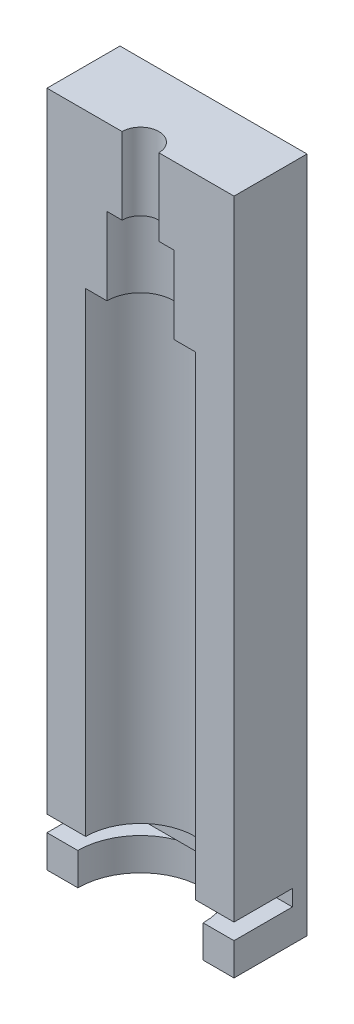
ISO-10303-21;
HEADER;
FILE_DESCRIPTION(('STEP AP214'),'2;1');
FILE_NAME('part.step','',(''),(''),'','','');
FILE_SCHEMA(('AUTOMOTIVE_DESIGN { 1 0 10303 214 1 1 1 1 }'));
ENDSEC;
DATA;
#1=APPLICATION_CONTEXT('core data for automotive mechanical design processes');
#2=APPLICATION_PROTOCOL_DEFINITION('international standard','automotive_design',2000,#1);
#3=PRODUCT_CONTEXT('',#1,'mechanical');
#4=PRODUCT('Part','Part','',(#3));
#5=PRODUCT_RELATED_PRODUCT_CATEGORY('part','',(#4));
#6=PRODUCT_DEFINITION_FORMATION('','',#4);
#7=PRODUCT_DEFINITION_CONTEXT('part definition',#1,'design');
#8=PRODUCT_DEFINITION('design','',#6,#7);
#9=PRODUCT_DEFINITION_SHAPE('','',#8);
#10=(LENGTH_UNIT() NAMED_UNIT(*) SI_UNIT(.MILLI.,.METRE.));
#11=(NAMED_UNIT(*) PLANE_ANGLE_UNIT() SI_UNIT($,.RADIAN.));
#12=(NAMED_UNIT(*) SI_UNIT($,.STERADIAN.) SOLID_ANGLE_UNIT());
#13=UNCERTAINTY_MEASURE_WITH_UNIT(LENGTH_MEASURE(1.E-05),#10,'distance_accuracy_value','');
#14=(GEOMETRIC_REPRESENTATION_CONTEXT(3) GLOBAL_UNCERTAINTY_ASSIGNED_CONTEXT((#13)) GLOBAL_UNIT_ASSIGNED_CONTEXT((#10,
#11,#12)) REPRESENTATION_CONTEXT('',''));
#15=CARTESIAN_POINT('',(0.,0.,0.));
#16=DIRECTION('',(0.,0.,1.));
#17=DIRECTION('',(1.,0.,0.));
#18=AXIS2_PLACEMENT_3D('',#15,#16,#17);
#19=CARTESIAN_POINT('',(0.,0.,10.));
#20=DIRECTION('',(0.,0.,-1.));
#21=DIRECTION('',(-1.,0.,0.));
#22=AXIS2_PLACEMENT_3D('',#19,#20,#21);
#23=PLANE('',#22);
#24=DIRECTION('',(0.,-1.,0.));
#25=VECTOR('',#24,1.);
#26=CARTESIAN_POINT('',(-124.383047755614,-75.,10.));
#27=LINE('',#26,#25);
#28=CARTESIAN_POINT('',(-124.383047755614,17.7491601343785,10.));
#29=VERTEX_POINT('',#28);
#30=CARTESIAN_POINT('',(-124.383047755614,-68.3710816059266,10.));
#31=VERTEX_POINT('',#30);
#32=EDGE_CURVE('E163',#29,#31,#27,.T.);
#33=ORIENTED_EDGE('',*,*,#32,.F.);
#34=DIRECTION('',(1.,0.,0.));
#35=VECTOR('',#34,1.);
#36=CARTESIAN_POINT('',(-150.,17.7491601343785,10.));
#37=LINE('',#36,#35);
#38=CARTESIAN_POINT('',(-134.67339682012,17.7491601343785,10.));
#39=VERTEX_POINT('',#38);
#40=EDGE_CURVE('E43',#39,#29,#37,.T.);
#41=ORIENTED_EDGE('',*,*,#40,.F.);
#42=DIRECTION('',(0.,-1.,0.));
#43=VECTOR('',#42,1.);
#44=CARTESIAN_POINT('',(-134.67339682012,-3.37108160592661,10.));
#45=LINE('',#44,#43);
#46=CARTESIAN_POINT('',(-134.67339682012,7.23653437832854,10.));
#47=VERTEX_POINT('',#46);
#48=EDGE_CURVE('E60',#47,#39,#45,.F.);
#49=ORIENTED_EDGE('',*,*,#48,.F.);
#50=DIRECTION('',(-1.,0.,0.));
#51=VECTOR('',#50,1.);
#52=CARTESIAN_POINT('',(0.,7.23653437832854,10.));
#53=LINE('',#52,#51);
#54=CARTESIAN_POINT('',(-132.591523877807,7.23653437832854,10.));
#55=VERTEX_POINT('',#54);
#56=EDGE_CURVE('E11',#55,#47,#53,.T.);
#57=ORIENTED_EDGE('',*,*,#56,.F.);
#58=DIRECTION('',(0.,-1.,0.));
#59=VECTOR('',#58,1.);
#60=CARTESIAN_POINT('',(-132.591523877807,-3.37108160592661,10.));
#61=LINE('',#60,#59);
#62=CARTESIAN_POINT('',(-132.591523877807,-3.37108160592661,10.));
#63=VERTEX_POINT('',#62);
#64=EDGE_CURVE('E287',#63,#55,#61,.F.);
#65=ORIENTED_EDGE('',*,*,#64,.F.);
#66=DIRECTION('',(-1.,0.,0.));
#67=VECTOR('',#66,1.);
#68=CARTESIAN_POINT('',(0.,-3.37108160592661,10.));
#69=LINE('',#68,#67);
#70=CARTESIAN_POINT('',(-129.691523877807,-3.37108160592661,10.));
#71=VERTEX_POINT('',#70);
#72=EDGE_CURVE('E254',#71,#63,#69,.T.);
#73=ORIENTED_EDGE('',*,*,#72,.F.);
#74=DIRECTION('',(0.,1.,0.));
#75=VECTOR('',#74,1.);
#76=CARTESIAN_POINT('',(-129.691523877807,75.,10.));
#77=LINE('',#76,#75);
#78=CARTESIAN_POINT('',(-129.691523877807,-68.3710816059266,10.));
#79=VERTEX_POINT('',#78);
#80=EDGE_CURVE('E210',#79,#71,#77,.T.);
#81=ORIENTED_EDGE('',*,*,#80,.F.);
#82=DIRECTION('',(-1.,0.,0.));
#83=VECTOR('',#82,1.);
#84=CARTESIAN_POINT('',(-150.383047755614,-68.3710816059266,10.));
#85=LINE('',#84,#83);
#86=EDGE_CURVE('E172',#31,#79,#85,.T.);
#87=ORIENTED_EDGE('',*,*,#86,.F.);
#88=EDGE_LOOP('',(#33,#41,#49,#57,#65,#73,#81,#87));
#89=FACE_BOUND('',#88,.T.);
#90=ADVANCED_FACE('F39',(#89),#23,.F.);
#91=DIRECTION('',(0.,-1.,0.));
#92=VECTOR('',#91,1.);
#93=CARTESIAN_POINT('',(-124.383047755614,-75.,10.));
#94=LINE('',#93,#92);
#95=CARTESIAN_POINT('',(-124.383047755614,-70.5710816059266,10.));
#96=VERTEX_POINT('',#95);
#97=CARTESIAN_POINT('',(-124.383047755614,-75.,10.));
#98=VERTEX_POINT('',#97);
#99=EDGE_CURVE('E174',#96,#98,#94,.T.);
#100=ORIENTED_EDGE('',*,*,#99,.F.);
#101=DIRECTION('',(1.,0.,0.));
#102=VECTOR('',#101,1.);
#103=CARTESIAN_POINT('',(-150.383047755614,-70.5710816059266,10.));
#104=LINE('',#103,#102);
#105=CARTESIAN_POINT('',(-128.604847788354,-70.5710816059266,10.));
#106=VERTEX_POINT('',#105);
#107=EDGE_CURVE('E230',#106,#96,#104,.T.);
#108=ORIENTED_EDGE('',*,*,#107,.F.);
#109=DIRECTION('',(0.,1.,0.));
#110=VECTOR('',#109,1.);
#111=CARTESIAN_POINT('',(-128.604847788354,-70.5710816059266,10.));
#112=LINE('',#111,#110);
#113=CARTESIAN_POINT('',(-128.604847788354,-75.,10.));
#114=VERTEX_POINT('',#113);
#115=EDGE_CURVE('E184',#106,#114,#112,.F.);
#116=ORIENTED_EDGE('',*,*,#115,.T.);
#117=DIRECTION('',(-1.,0.,0.));
#118=VECTOR('',#117,1.);
#119=CARTESIAN_POINT('',(0.,-75.,10.));
#120=LINE('',#119,#118);
#121=EDGE_CURVE('E235',#114,#98,#120,.F.);
#122=ORIENTED_EDGE('',*,*,#121,.T.);
#123=EDGE_LOOP('',(#100,#108,#116,#122));
#124=FACE_BOUND('',#123,.T.);
#125=ADVANCED_FACE('F272',(#124),#23,.F.);
#126=CARTESIAN_POINT('',(0.,0.,0.));
#127=DIRECTION('',(0.,0.,-1.));
#128=DIRECTION('',(-1.,0.,0.));
#129=AXIS2_PLACEMENT_3D('',#126,#127,#128);
#130=PLANE('',#129);
#131=DIRECTION('',(1.,0.,0.));
#132=VECTOR('',#131,1.);
#133=CARTESIAN_POINT('',(-150.,17.7491601343785,0.));
#134=LINE('',#133,#132);
#135=CARTESIAN_POINT('',(-150.,17.7491601343785,0.));
#136=VERTEX_POINT('',#135);
#137=CARTESIAN_POINT('',(-124.383047755614,17.7491601343785,0.));
#138=VERTEX_POINT('',#137);
#139=EDGE_CURVE('E185',#136,#138,#134,.T.);
#140=ORIENTED_EDGE('',*,*,#139,.T.);
#141=DIRECTION('',(0.,-1.,0.));
#142=VECTOR('',#141,1.);
#143=CARTESIAN_POINT('',(-124.383047755614,-75.,0.));
#144=LINE('',#143,#142);
#145=CARTESIAN_POINT('',(-124.383047755614,-75.,0.));
#146=VERTEX_POINT('',#145);
#147=EDGE_CURVE('E161',#138,#146,#144,.T.);
#148=ORIENTED_EDGE('',*,*,#147,.T.);
#149=DIRECTION('',(1.,0.,0.));
#150=VECTOR('',#149,1.);
#151=CARTESIAN_POINT('',(150.,-75.,0.));
#152=LINE('',#151,#150);
#153=CARTESIAN_POINT('',(-150.,-75.,0.));
#154=VERTEX_POINT('',#153);
#155=EDGE_CURVE('E237',#154,#146,#152,.T.);
#156=ORIENTED_EDGE('',*,*,#155,.F.);
#157=DIRECTION('',(0.,-1.,0.));
#158=VECTOR('',#157,1.);
#159=CARTESIAN_POINT('',(-150.,-75.,0.));
#160=LINE('',#159,#158);
#161=EDGE_CURVE('E240',#136,#154,#160,.T.);
#162=ORIENTED_EDGE('',*,*,#161,.F.);
#163=EDGE_LOOP('',(#140,#148,#156,#162));
#164=FACE_BOUND('',#163,.T.);
#165=ADVANCED_FACE('F316',(#164),#130,.T.);
#166=CARTESIAN_POINT('',(-150.,17.7491601343785,0.));
#167=DIRECTION('',(0.,-1.,0.));
#168=DIRECTION('',(0.,0.,-1.));
#169=AXIS2_PLACEMENT_3D('',#166,#167,#168);
#170=PLANE('',#169);
#171=DIRECTION('',(0.,0.,1.));
#172=VECTOR('',#171,1.);
#173=CARTESIAN_POINT('',(-124.383047755614,17.7491601343785,0.));
#174=LINE('',#173,#172);
#175=EDGE_CURVE('E159',#138,#29,#174,.T.);
#176=ORIENTED_EDGE('',*,*,#175,.F.);
#177=ORIENTED_EDGE('',*,*,#139,.F.);
#178=DIRECTION('',(0.,0.,1.));
#179=VECTOR('',#178,1.);
#180=CARTESIAN_POINT('',(-150.,17.7491601343785,0.));
#181=LINE('',#180,#179);
#182=CARTESIAN_POINT('',(-150.,17.7491601343785,10.));
#183=VERTEX_POINT('',#182);
#184=EDGE_CURVE('E200',#136,#183,#181,.T.);
#185=ORIENTED_EDGE('',*,*,#184,.T.);
#186=DIRECTION('',(1.,0.,0.));
#187=VECTOR('',#186,1.);
#188=CARTESIAN_POINT('',(-150.,17.7491601343785,10.));
#189=LINE('',#188,#187);
#190=CARTESIAN_POINT('',(-139.709650935494,17.7491601343785,10.));
#191=VERTEX_POINT('',#190);
#192=EDGE_CURVE('E179',#183,#191,#189,.T.);
#193=ORIENTED_EDGE('',*,*,#192,.T.);
#194=CARTESIAN_POINT('',(-137.191523877807,17.7491601343785,10.));
#195=DIRECTION('',(0.,-1.,0.));
#196=DIRECTION('',(0.,0.,-1.));
#197=AXIS2_PLACEMENT_3D('',#194,#195,#196);
#198=CIRCLE('',#197,2.51812705768732);
#199=EDGE_CURVE('E177',#39,#191,#198,.F.);
#200=ORIENTED_EDGE('',*,*,#199,.F.);
#201=ORIENTED_EDGE('',*,*,#40,.T.);
#202=EDGE_LOOP('',(#176,#177,#185,#193,#200,#201));
#203=FACE_BOUND('',#202,.T.);
#204=ADVANCED_FACE('F180',(#203),#170,.F.);
#205=DIRECTION('',(0.,-1.,0.));
#206=VECTOR('',#205,1.);
#207=CARTESIAN_POINT('',(-139.709650935494,-3.37108160592661,10.));
#208=LINE('',#207,#206);
#209=CARTESIAN_POINT('',(-139.709650935494,7.23653437832854,10.));
#210=VERTEX_POINT('',#209);
#211=EDGE_CURVE('E262',#191,#210,#208,.T.);
#212=ORIENTED_EDGE('',*,*,#211,.F.);
#213=ORIENTED_EDGE('',*,*,#192,.F.);
#214=DIRECTION('',(0.,-1.,0.));
#215=VECTOR('',#214,1.);
#216=CARTESIAN_POINT('',(-150.,-75.,10.));
#217=LINE('',#216,#215);
#218=CARTESIAN_POINT('',(-150.,-68.3710816059266,10.));
#219=VERTEX_POINT('',#218);
#220=EDGE_CURVE('E229',#183,#219,#217,.T.);
#221=ORIENTED_EDGE('',*,*,#220,.T.);
#222=CARTESIAN_POINT('',(-144.691523877807,-68.3710816059266,10.));
#223=VERTEX_POINT('',#222);
#224=EDGE_CURVE('E211',#223,#219,#85,.T.);
#225=ORIENTED_EDGE('',*,*,#224,.F.);
#226=DIRECTION('',(0.,1.,0.));
#227=VECTOR('',#226,1.);
#228=CARTESIAN_POINT('',(-144.691523877807,75.,10.));
#229=LINE('',#228,#227);
#230=CARTESIAN_POINT('',(-144.691523877807,-3.37108160592661,10.));
#231=VERTEX_POINT('',#230);
#232=EDGE_CURVE('E209',#231,#223,#229,.F.);
#233=ORIENTED_EDGE('',*,*,#232,.F.);
#234=CARTESIAN_POINT('',(-141.791523877807,-3.37108160592661,10.));
#235=VERTEX_POINT('',#234);
#236=EDGE_CURVE('E255',#235,#231,#69,.T.);
#237=ORIENTED_EDGE('',*,*,#236,.F.);
#238=DIRECTION('',(0.,-1.,0.));
#239=VECTOR('',#238,1.);
#240=CARTESIAN_POINT('',(-141.791523877807,-3.37108160592661,10.));
#241=LINE('',#240,#239);
#242=CARTESIAN_POINT('',(-141.791523877807,7.23653437832854,10.));
#243=VERTEX_POINT('',#242);
#244=EDGE_CURVE('E263',#243,#235,#241,.T.);
#245=ORIENTED_EDGE('',*,*,#244,.F.);
#246=EDGE_CURVE('E47',#210,#243,#53,.T.);
#247=ORIENTED_EDGE('',*,*,#246,.F.);
#248=EDGE_LOOP('',(#212,#213,#221,#225,#233,#237,#245,#247));
#249=FACE_BOUND('',#248,.T.);
#250=ADVANCED_FACE('F325',(#249),#23,.F.);
#251=DIRECTION('',(1.,0.,0.));
#252=VECTOR('',#251,1.);
#253=CARTESIAN_POINT('',(150.,-75.,10.));
#254=LINE('',#253,#252);
#255=CARTESIAN_POINT('',(-150.,-75.,10.));
#256=VERTEX_POINT('',#255);
#257=CARTESIAN_POINT('',(-145.778199967261,-75.,10.));
#258=VERTEX_POINT('',#257);
#259=EDGE_CURVE('E234',#256,#258,#254,.T.);
#260=ORIENTED_EDGE('',*,*,#259,.T.);
#261=DIRECTION('',(0.,1.,0.));
#262=VECTOR('',#261,1.);
#263=CARTESIAN_POINT('',(-145.778199967261,-70.5710816059266,10.));
#264=LINE('',#263,#262);
#265=CARTESIAN_POINT('',(-145.778199967261,-70.5710816059266,10.));
#266=VERTEX_POINT('',#265);
#267=EDGE_CURVE('E181',#258,#266,#264,.T.);
#268=ORIENTED_EDGE('',*,*,#267,.T.);
#269=CARTESIAN_POINT('',(-150.,-70.5710816059266,10.));
#270=VERTEX_POINT('',#269);
#271=EDGE_CURVE('E228',#270,#266,#104,.T.);
#272=ORIENTED_EDGE('',*,*,#271,.F.);
#273=EDGE_CURVE('E231',#270,#256,#217,.T.);
#274=ORIENTED_EDGE('',*,*,#273,.T.);
#275=EDGE_LOOP('',(#260,#268,#272,#274));
#276=FACE_BOUND('',#275,.T.);
#277=ADVANCED_FACE('F317',(#276),#23,.F.);
#278=CARTESIAN_POINT('',(-150.383047755614,-70.5710816059266,2.));
#279=DIRECTION('',(0.,-1.,0.));
#280=DIRECTION('',(0.,0.,-1.));
#281=AXIS2_PLACEMENT_3D('',#278,#279,#280);
#282=PLANE('',#281);
#283=DIRECTION('',(1.,0.,0.));
#284=VECTOR('',#283,1.);
#285=CARTESIAN_POINT('',(-150.383047755614,-70.5710816059266,2.));
#286=LINE('',#285,#284);
#287=CARTESIAN_POINT('',(-134.072067792976,-70.5710816059266,2.));
#288=VERTEX_POINT('',#287);
#289=CARTESIAN_POINT('',(-124.383047755614,-70.5710816059266,2.));
#290=VERTEX_POINT('',#289);
#291=EDGE_CURVE('E220',#288,#290,#286,.T.);
#292=ORIENTED_EDGE('',*,*,#291,.F.);
#293=CARTESIAN_POINT('',(-137.191523877807,-70.5710816059266,10.));
#294=DIRECTION('',(0.,1.,0.));
#295=DIRECTION('',(0.,0.,1.));
#296=AXIS2_PLACEMENT_3D('',#293,#294,#295);
#297=CIRCLE('',#296,8.58667608945341);
#298=EDGE_CURVE('E199',#106,#288,#297,.T.);
#299=ORIENTED_EDGE('',*,*,#298,.F.);
#300=ORIENTED_EDGE('',*,*,#107,.T.);
#301=DIRECTION('',(0.,0.,1.));
#302=VECTOR('',#301,1.);
#303=CARTESIAN_POINT('',(-124.383047755614,-70.5710816059266,2.));
#304=LINE('',#303,#302);
#305=EDGE_CURVE('E239',#290,#96,#304,.T.);
#306=ORIENTED_EDGE('',*,*,#305,.F.);
#307=EDGE_LOOP('',(#292,#299,#300,#306));
#308=FACE_BOUND('',#307,.T.);
#309=ADVANCED_FACE('F304',(#308),#282,.F.);
#310=CARTESIAN_POINT('',(-150.,-75.,10.));
#311=DIRECTION('',(1.,0.,0.));
#312=DIRECTION('',(0.,0.,-1.));
#313=AXIS2_PLACEMENT_3D('',#310,#311,#312);
#314=PLANE('',#313);
#315=ORIENTED_EDGE('',*,*,#184,.F.);
#316=ORIENTED_EDGE('',*,*,#161,.T.);
#317=DIRECTION('',(0.,0.,-1.));
#318=VECTOR('',#317,1.);
#319=CARTESIAN_POINT('',(-150.,-75.,10.));
#320=LINE('',#319,#318);
#321=EDGE_CURVE('E236',#256,#154,#320,.T.);
#322=ORIENTED_EDGE('',*,*,#321,.F.);
#323=ORIENTED_EDGE('',*,*,#273,.F.);
#324=DIRECTION('',(0.,0.,-1.));
#325=VECTOR('',#324,1.);
#326=CARTESIAN_POINT('',(-150.,-70.5710816059266,10.));
#327=LINE('',#326,#325);
#328=CARTESIAN_POINT('',(-150.,-70.5710816059266,2.));
#329=VERTEX_POINT('',#328);
#330=EDGE_CURVE('E248',#270,#329,#327,.T.);
#331=ORIENTED_EDGE('',*,*,#330,.T.);
#332=DIRECTION('',(0.,-1.,0.));
#333=VECTOR('',#332,1.);
#334=CARTESIAN_POINT('',(-150.,-75.,2.));
#335=LINE('',#334,#333);
#336=CARTESIAN_POINT('',(-150.,-68.3710816059266,2.));
#337=VERTEX_POINT('',#336);
#338=EDGE_CURVE('E226',#337,#329,#335,.T.);
#339=ORIENTED_EDGE('',*,*,#338,.F.);
#340=DIRECTION('',(0.,0.,1.));
#341=VECTOR('',#340,1.);
#342=CARTESIAN_POINT('',(-150.,-68.3710816059266,10.));
#343=LINE('',#342,#341);
#344=EDGE_CURVE('E246',#337,#219,#343,.T.);
#345=ORIENTED_EDGE('',*,*,#344,.T.);
#346=ORIENTED_EDGE('',*,*,#220,.F.);
#347=EDGE_LOOP('',(#315,#316,#322,#323,#331,#339,#345,#346));
#348=FACE_BOUND('',#347,.T.);
#349=ADVANCED_FACE('F41',(#348),#314,.F.);
#350=CARTESIAN_POINT('',(150.,-75.,10.));
#351=DIRECTION('',(0.,1.,0.));
#352=DIRECTION('',(0.,0.,1.));
#353=AXIS2_PLACEMENT_3D('',#350,#351,#352);
#354=PLANE('',#353);
#355=ORIENTED_EDGE('',*,*,#155,.T.);
#356=DIRECTION('',(0.,0.,1.));
#357=VECTOR('',#356,1.);
#358=CARTESIAN_POINT('',(-124.383047755614,-75.,0.));
#359=LINE('',#358,#357);
#360=EDGE_CURVE('E153',#146,#98,#359,.T.);
#361=ORIENTED_EDGE('',*,*,#360,.T.);
#362=ORIENTED_EDGE('',*,*,#121,.F.);
#363=CARTESIAN_POINT('',(-137.191523877807,-75.,10.));
#364=DIRECTION('',(0.,1.,0.));
#365=DIRECTION('',(0.,0.,1.));
#366=AXIS2_PLACEMENT_3D('',#363,#364,#365);
#367=CIRCLE('',#366,8.58667608945341);
#368=EDGE_CURVE('E192',#114,#258,#367,.T.);
#369=ORIENTED_EDGE('',*,*,#368,.T.);
#370=ORIENTED_EDGE('',*,*,#259,.F.);
#371=ORIENTED_EDGE('',*,*,#321,.T.);
#372=EDGE_LOOP('',(#355,#361,#362,#369,#370,#371));
#373=FACE_BOUND('',#372,.T.);
#374=ADVANCED_FACE('F273',(#373),#354,.F.);
#375=ORIENTED_EDGE('',*,*,#271,.T.);
#376=CARTESIAN_POINT('',(-140.310979962638,-70.5710816059266,2.));
#377=VERTEX_POINT('',#376);
#378=EDGE_CURVE('E290',#377,#266,#297,.T.);
#379=ORIENTED_EDGE('',*,*,#378,.F.);
#380=EDGE_CURVE('E218',#329,#377,#286,.T.);
#381=ORIENTED_EDGE('',*,*,#380,.F.);
#382=ORIENTED_EDGE('',*,*,#330,.F.);
#383=EDGE_LOOP('',(#375,#379,#381,#382));
#384=FACE_BOUND('',#383,.T.);
#385=ADVANCED_FACE('F311',(#384),#282,.F.);
#386=CARTESIAN_POINT('',(-150.383047755614,-68.3710816059266,2.));
#387=DIRECTION('',(0.,1.,0.));
#388=DIRECTION('',(0.,0.,1.));
#389=AXIS2_PLACEMENT_3D('',#386,#387,#388);
#390=PLANE('',#389);
#391=CARTESIAN_POINT('',(-137.191523877807,-68.3710816059266,10.));
#392=DIRECTION('',(0.,1.,0.));
#393=DIRECTION('',(0.,0.,1.));
#394=AXIS2_PLACEMENT_3D('',#391,#392,#393);
#395=CIRCLE('',#394,7.49999999999995);
#396=EDGE_CURVE('E202',#79,#223,#395,.T.);
#397=ORIENTED_EDGE('',*,*,#396,.T.);
#398=ORIENTED_EDGE('',*,*,#224,.T.);
#399=ORIENTED_EDGE('',*,*,#344,.F.);
#400=DIRECTION('',(-1.,0.,0.));
#401=VECTOR('',#400,1.);
#402=CARTESIAN_POINT('',(-150.383047755614,-68.3710816059266,2.));
#403=LINE('',#402,#401);
#404=CARTESIAN_POINT('',(-124.383047755614,-68.3710816059266,2.));
#405=VERTEX_POINT('',#404);
#406=EDGE_CURVE('E215',#405,#337,#403,.T.);
#407=ORIENTED_EDGE('',*,*,#406,.F.);
#408=DIRECTION('',(0.,0.,1.));
#409=VECTOR('',#408,1.);
#410=CARTESIAN_POINT('',(-124.383047755614,-68.3710816059266,2.));
#411=LINE('',#410,#409);
#412=EDGE_CURVE('E225',#405,#31,#411,.T.);
#413=ORIENTED_EDGE('',*,*,#412,.T.);
#414=ORIENTED_EDGE('',*,*,#86,.T.);
#415=EDGE_LOOP('',(#397,#398,#399,#407,#413,#414));
#416=FACE_BOUND('',#415,.T.);
#417=ADVANCED_FACE('F330',(#416),#390,.F.);
#418=CARTESIAN_POINT('',(0.,0.,2.));
#419=DIRECTION('',(0.,0.,1.));
#420=DIRECTION('',(1.,0.,0.));
#421=AXIS2_PLACEMENT_3D('',#418,#419,#420);
#422=PLANE('',#421);
#423=ORIENTED_EDGE('',*,*,#338,.T.);
#424=ORIENTED_EDGE('',*,*,#380,.T.);
#425=EDGE_CURVE('E224',#377,#288,#286,.T.);
#426=ORIENTED_EDGE('',*,*,#425,.T.);
#427=ORIENTED_EDGE('',*,*,#291,.T.);
#428=DIRECTION('',(0.,1.,0.));
#429=VECTOR('',#428,1.);
#430=CARTESIAN_POINT('',(-124.383047755614,-68.3710816059266,2.));
#431=LINE('',#430,#429);
#432=EDGE_CURVE('E212',#290,#405,#431,.T.);
#433=ORIENTED_EDGE('',*,*,#432,.T.);
#434=ORIENTED_EDGE('',*,*,#406,.T.);
#435=EDGE_LOOP('',(#423,#424,#426,#427,#433,#434));
#436=FACE_BOUND('',#435,.T.);
#437=ADVANCED_FACE('F310',(#436),#422,.T.);
#438=CARTESIAN_POINT('',(0.,-3.37108160592661,10.));
#439=DIRECTION('',(0.,-1.,0.));
#440=DIRECTION('',(0.,0.,-1.));
#441=AXIS2_PLACEMENT_3D('',#438,#439,#440);
#442=PLANE('',#441);
#443=ORIENTED_EDGE('',*,*,#72,.T.);
#444=CARTESIAN_POINT('',(-137.191523877807,-3.37108160592661,10.));
#445=DIRECTION('',(0.,-1.,0.));
#446=DIRECTION('',(0.,0.,-1.));
#447=AXIS2_PLACEMENT_3D('',#444,#445,#446);
#448=CIRCLE('',#447,4.59999999999999);
#449=EDGE_CURVE('E256',#63,#235,#448,.F.);
#450=ORIENTED_EDGE('',*,*,#449,.T.);
#451=ORIENTED_EDGE('',*,*,#236,.T.);
#452=CARTESIAN_POINT('',(-137.191523877807,-3.37108160592661,10.));
#453=DIRECTION('',(0.,1.,0.));
#454=DIRECTION('',(0.,0.,1.));
#455=AXIS2_PLACEMENT_3D('',#452,#453,#454);
#456=CIRCLE('',#455,7.49999999999995);
#457=EDGE_CURVE('E201',#71,#231,#456,.T.);
#458=ORIENTED_EDGE('',*,*,#457,.F.);
#459=EDGE_LOOP('',(#443,#450,#451,#458));
#460=FACE_BOUND('',#459,.T.);
#461=ADVANCED_FACE('F337',(#460),#442,.T.);
#462=CARTESIAN_POINT('',(-137.191523877807,75.,10.));
#463=DIRECTION('',(0.,1.,0.));
#464=DIRECTION('',(0.,0.,1.));
#465=AXIS2_PLACEMENT_3D('',#462,#463,#464);
#466=CYLINDRICAL_SURFACE('',#465,7.49999999999995);
#467=ORIENTED_EDGE('',*,*,#232,.T.);
#468=ORIENTED_EDGE('',*,*,#396,.F.);
#469=ORIENTED_EDGE('',*,*,#80,.T.);
#470=ORIENTED_EDGE('',*,*,#457,.T.);
#471=EDGE_LOOP('',(#467,#468,#469,#470));
#472=FACE_BOUND('',#471,.T.);
#473=ADVANCED_FACE('F332',(#472),#466,.F.);
#474=CARTESIAN_POINT('',(-137.191523877807,-70.5710816059266,10.));
#475=DIRECTION('',(0.,1.,0.));
#476=DIRECTION('',(0.,0.,1.));
#477=AXIS2_PLACEMENT_3D('',#474,#475,#476);
#478=CYLINDRICAL_SURFACE('',#477,8.58667608945341);
#479=ORIENTED_EDGE('',*,*,#368,.F.);
#480=ORIENTED_EDGE('',*,*,#115,.F.);
#481=ORIENTED_EDGE('',*,*,#298,.T.);
#482=EDGE_CURVE('E293',#288,#377,#297,.T.);
#483=ORIENTED_EDGE('',*,*,#482,.T.);
#484=ORIENTED_EDGE('',*,*,#378,.T.);
#485=ORIENTED_EDGE('',*,*,#267,.F.);
#486=EDGE_LOOP('',(#479,#480,#481,#483,#484,#485));
#487=FACE_BOUND('',#486,.T.);
#488=ADVANCED_FACE('F300',(#487),#478,.F.);
#489=CARTESIAN_POINT('',(-137.191523877807,-70.5710816059266,10.));
#490=DIRECTION('',(0.,1.,0.));
#491=DIRECTION('',(0.,0.,1.));
#492=AXIS2_PLACEMENT_3D('',#489,#490,#491);
#493=PLANE('',#492);
#494=ORIENTED_EDGE('',*,*,#425,.F.);
#495=ORIENTED_EDGE('',*,*,#482,.F.);
#496=EDGE_LOOP('',(#494,#495));
#497=FACE_BOUND('',#496,.T.);
#498=ADVANCED_FACE('F301',(#497),#493,.F.);
#499=CARTESIAN_POINT('',(-139.709650935494,7.23653437832854,10.));
#500=DIRECTION('',(0.,-1.,0.));
#501=DIRECTION('',(0.,0.,-1.));
#502=AXIS2_PLACEMENT_3D('',#499,#500,#501);
#503=PLANE('',#502);
#504=ORIENTED_EDGE('',*,*,#56,.T.);
#505=CARTESIAN_POINT('',(-137.191523877807,7.23653437832854,10.));
#506=DIRECTION('',(0.,-1.,0.));
#507=DIRECTION('',(0.,0.,-1.));
#508=AXIS2_PLACEMENT_3D('',#505,#506,#507);
#509=CIRCLE('',#508,2.51812705768731);
#510=EDGE_CURVE('E285',#210,#47,#509,.T.);
#511=ORIENTED_EDGE('',*,*,#510,.F.);
#512=ORIENTED_EDGE('',*,*,#246,.T.);
#513=CARTESIAN_POINT('',(-137.191523877807,7.23653437832854,10.));
#514=DIRECTION('',(0.,-1.,0.));
#515=DIRECTION('',(0.,0.,-1.));
#516=AXIS2_PLACEMENT_3D('',#513,#514,#515);
#517=CIRCLE('',#516,4.59999999999999);
#518=EDGE_CURVE('E170',#243,#55,#517,.T.);
#519=ORIENTED_EDGE('',*,*,#518,.T.);
#520=EDGE_LOOP('',(#504,#511,#512,#519));
#521=FACE_BOUND('',#520,.T.);
#522=ADVANCED_FACE('F342',(#521),#503,.T.);
#523=CARTESIAN_POINT('',(-137.191523877807,-3.37108160592661,10.));
#524=DIRECTION('',(0.,-1.,0.));
#525=DIRECTION('',(0.,0.,-1.));
#526=AXIS2_PLACEMENT_3D('',#523,#524,#525);
#527=CYLINDRICAL_SURFACE('',#526,4.59999999999999);
#528=ORIENTED_EDGE('',*,*,#64,.T.);
#529=ORIENTED_EDGE('',*,*,#518,.F.);
#530=ORIENTED_EDGE('',*,*,#244,.T.);
#531=ORIENTED_EDGE('',*,*,#449,.F.);
#532=EDGE_LOOP('',(#528,#529,#530,#531));
#533=FACE_BOUND('',#532,.T.);
#534=ADVANCED_FACE('F338',(#533),#527,.F.);
#535=CARTESIAN_POINT('',(-137.191523877807,-3.37108160592661,10.));
#536=DIRECTION('',(0.,-1.,0.));
#537=DIRECTION('',(0.,0.,-1.));
#538=AXIS2_PLACEMENT_3D('',#535,#536,#537);
#539=CYLINDRICAL_SURFACE('',#538,2.51812705768732);
#540=ORIENTED_EDGE('',*,*,#48,.T.);
#541=ORIENTED_EDGE('',*,*,#199,.T.);
#542=ORIENTED_EDGE('',*,*,#211,.T.);
#543=ORIENTED_EDGE('',*,*,#510,.T.);
#544=EDGE_LOOP('',(#540,#541,#542,#543));
#545=FACE_BOUND('',#544,.T.);
#546=ADVANCED_FACE('F343',(#545),#539,.F.);
#547=CARTESIAN_POINT('',(-124.383047755614,-75.,0.));
#548=DIRECTION('',(-1.,0.,0.));
#549=DIRECTION('',(0.,0.,1.));
#550=AXIS2_PLACEMENT_3D('',#547,#548,#549);
#551=PLANE('',#550);
#552=ORIENTED_EDGE('',*,*,#432,.F.);
#553=ORIENTED_EDGE('',*,*,#305,.T.);
#554=ORIENTED_EDGE('',*,*,#99,.T.);
#555=ORIENTED_EDGE('',*,*,#360,.F.);
#556=ORIENTED_EDGE('',*,*,#147,.F.);
#557=ORIENTED_EDGE('',*,*,#175,.T.);
#558=ORIENTED_EDGE('',*,*,#32,.T.);
#559=ORIENTED_EDGE('',*,*,#412,.F.);
#560=EDGE_LOOP('',(#552,#553,#554,#555,#556,#557,#558,#559));
#561=FACE_BOUND('',#560,.T.);
#562=ADVANCED_FACE('F158',(#561),#551,.F.);
#563=CLOSED_SHELL('',(#90,#125,#165,#204,#250,#277,#309,#349,#374,#385,#417,#437,#461,#473,#488,
#498,#522,#534,#546,#562));
#564=MANIFOLD_SOLID_BREP('B2',#563);
#565=ADVANCED_BREP_SHAPE_REPRESENTATION('',(#18,#564),#14);
#566=SHAPE_DEFINITION_REPRESENTATION(#9,#565);
ENDSEC;
END-ISO-10303-21;
